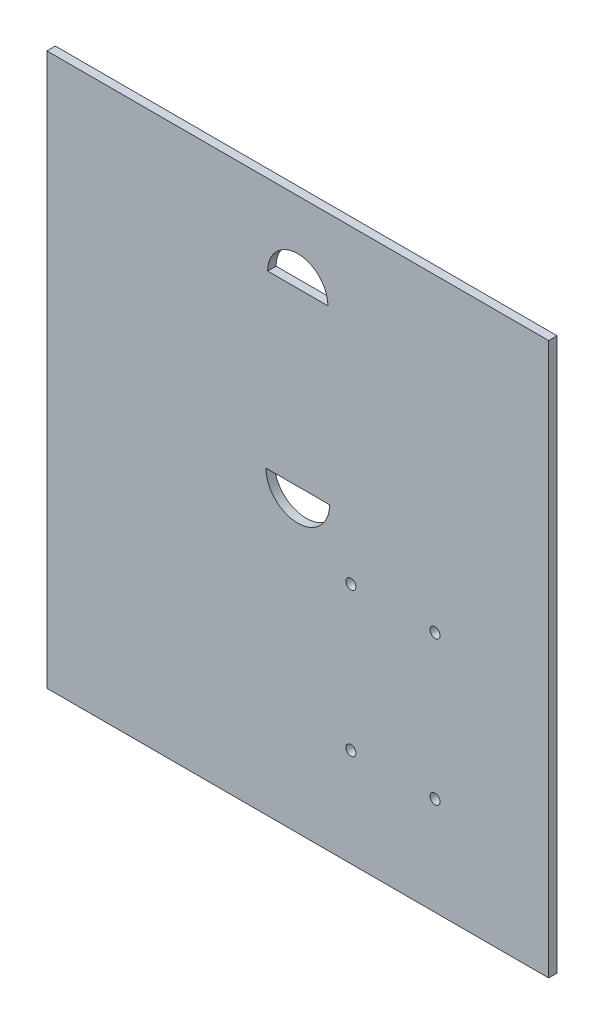
ISO-10303-21;
HEADER;
FILE_DESCRIPTION(('STEP AP214'),'2;1');
FILE_NAME('part.step','',(''),(''),'','','');
FILE_SCHEMA(('AUTOMOTIVE_DESIGN { 1 0 10303 214 1 1 1 1 }'));
ENDSEC;
DATA;
#1=APPLICATION_CONTEXT('core data for automotive mechanical design processes');
#2=APPLICATION_PROTOCOL_DEFINITION('international standard','automotive_design',2000,#1);
#3=PRODUCT_CONTEXT('',#1,'mechanical');
#4=PRODUCT('Part','Part','',(#3));
#5=PRODUCT_RELATED_PRODUCT_CATEGORY('part','',(#4));
#6=PRODUCT_DEFINITION_FORMATION('','',#4);
#7=PRODUCT_DEFINITION_CONTEXT('part definition',#1,'design');
#8=PRODUCT_DEFINITION('design','',#6,#7);
#9=PRODUCT_DEFINITION_SHAPE('','',#8);
#10=(LENGTH_UNIT() NAMED_UNIT(*) SI_UNIT(.MILLI.,.METRE.));
#11=(NAMED_UNIT(*) PLANE_ANGLE_UNIT() SI_UNIT($,.RADIAN.));
#12=(NAMED_UNIT(*) SI_UNIT($,.STERADIAN.) SOLID_ANGLE_UNIT());
#13=UNCERTAINTY_MEASURE_WITH_UNIT(LENGTH_MEASURE(1.E-05),#10,'distance_accuracy_value','');
#14=(GEOMETRIC_REPRESENTATION_CONTEXT(3) GLOBAL_UNCERTAINTY_ASSIGNED_CONTEXT((#13)) GLOBAL_UNIT_ASSIGNED_CONTEXT((#10,
#11,#12)) REPRESENTATION_CONTEXT('',''));
#15=CARTESIAN_POINT('',(0.,0.,0.));
#16=DIRECTION('',(0.,0.,1.));
#17=DIRECTION('',(1.,0.,0.));
#18=AXIS2_PLACEMENT_3D('',#15,#16,#17);
#19=CARTESIAN_POINT('',(-220.228215767635,110.114107883817,4.2));
#20=DIRECTION('',(1.,0.,0.));
#21=DIRECTION('',(0.,0.,-1.));
#22=AXIS2_PLACEMENT_3D('',#19,#20,#21);
#23=PLANE('',#22);
#24=DIRECTION('',(0.,-1.,0.));
#25=VECTOR('',#24,1.);
#26=CARTESIAN_POINT('',(-220.228215767635,110.114107883817,0.));
#27=LINE('',#26,#25);
#28=CARTESIAN_POINT('',(-220.228215767635,110.114107883817,0.));
#29=VERTEX_POINT('',#28);
#30=CARTESIAN_POINT('',(-220.228215767635,-164.885892116183,0.));
#31=VERTEX_POINT('',#30);
#32=EDGE_CURVE('E131',#29,#31,#27,.T.);
#33=ORIENTED_EDGE('',*,*,#32,.T.);
#34=DIRECTION('',(0.,0.,-1.));
#35=VECTOR('',#34,1.);
#36=CARTESIAN_POINT('',(-220.228215767635,-164.885892116183,4.2));
#37=LINE('',#36,#35);
#38=CARTESIAN_POINT('',(-220.228215767635,-164.885892116183,4.2));
#39=VERTEX_POINT('',#38);
#40=EDGE_CURVE('E11',#39,#31,#37,.T.);
#41=ORIENTED_EDGE('',*,*,#40,.F.);
#42=DIRECTION('',(0.,-1.,0.));
#43=VECTOR('',#42,1.);
#44=CARTESIAN_POINT('',(-220.228215767635,110.114107883817,4.2));
#45=LINE('',#44,#43);
#46=CARTESIAN_POINT('',(-220.228215767635,110.114107883817,4.2));
#47=VERTEX_POINT('',#46);
#48=EDGE_CURVE('E184',#47,#39,#45,.T.);
#49=ORIENTED_EDGE('',*,*,#48,.F.);
#50=DIRECTION('',(0.,0.,-1.));
#51=VECTOR('',#50,1.);
#52=CARTESIAN_POINT('',(-220.228215767635,110.114107883817,4.2));
#53=LINE('',#52,#51);
#54=EDGE_CURVE('E198',#47,#29,#53,.T.);
#55=ORIENTED_EDGE('',*,*,#54,.T.);
#56=EDGE_LOOP('',(#33,#41,#49,#55));
#57=FACE_BOUND('',#56,.T.);
#58=ADVANCED_FACE('F39',(#57),#23,.F.);
#59=CARTESIAN_POINT('',(-220.228215767635,-164.885892116183,4.2));
#60=DIRECTION('',(0.,1.,0.));
#61=DIRECTION('',(-1.,0.,0.));
#62=AXIS2_PLACEMENT_3D('',#59,#60,#61);
#63=PLANE('',#62);
#64=DIRECTION('',(1.,0.,0.));
#65=VECTOR('',#64,1.);
#66=CARTESIAN_POINT('',(-220.228215767635,-164.885892116183,0.));
#67=LINE('',#66,#65);
#68=CARTESIAN_POINT('',(29.7717842323652,-164.885892116183,0.));
#69=VERTEX_POINT('',#68);
#70=EDGE_CURVE('E202',#31,#69,#67,.T.);
#71=ORIENTED_EDGE('',*,*,#70,.T.);
#72=DIRECTION('',(0.,0.,-1.));
#73=VECTOR('',#72,1.);
#74=CARTESIAN_POINT('',(29.7717842323652,-164.885892116183,4.2));
#75=LINE('',#74,#73);
#76=CARTESIAN_POINT('',(29.7717842323652,-164.885892116183,4.2));
#77=VERTEX_POINT('',#76);
#78=EDGE_CURVE('E47',#77,#69,#75,.T.);
#79=ORIENTED_EDGE('',*,*,#78,.F.);
#80=DIRECTION('',(1.,0.,0.));
#81=VECTOR('',#80,1.);
#82=CARTESIAN_POINT('',(-220.228215767635,-164.885892116183,4.2));
#83=LINE('',#82,#81);
#84=EDGE_CURVE('E188',#39,#77,#83,.T.);
#85=ORIENTED_EDGE('',*,*,#84,.F.);
#86=ORIENTED_EDGE('',*,*,#40,.T.);
#87=EDGE_LOOP('',(#71,#79,#85,#86));
#88=FACE_BOUND('',#87,.T.);
#89=ADVANCED_FACE('F237',(#88),#63,.F.);
#90=CARTESIAN_POINT('',(29.7717842323651,110.114107883817,4.2));
#91=DIRECTION('',(-1.,0.,0.));
#92=DIRECTION('',(0.,-1.,0.));
#93=AXIS2_PLACEMENT_3D('',#90,#91,#92);
#94=PLANE('',#93);
#95=DIRECTION('',(0.,1.,0.));
#96=VECTOR('',#95,1.);
#97=CARTESIAN_POINT('',(29.7717842323651,110.114107883817,0.));
#98=LINE('',#97,#96);
#99=CARTESIAN_POINT('',(29.7717842323651,110.114107883817,0.));
#100=VERTEX_POINT('',#99);
#101=EDGE_CURVE('E205',#69,#100,#98,.T.);
#102=ORIENTED_EDGE('',*,*,#101,.T.);
#103=DIRECTION('',(0.,0.,-1.));
#104=VECTOR('',#103,1.);
#105=CARTESIAN_POINT('',(29.7717842323651,110.114107883817,4.2));
#106=LINE('',#105,#104);
#107=CARTESIAN_POINT('',(29.7717842323651,110.114107883817,4.2));
#108=VERTEX_POINT('',#107);
#109=EDGE_CURVE('E213',#108,#100,#106,.T.);
#110=ORIENTED_EDGE('',*,*,#109,.F.);
#111=DIRECTION('',(0.,1.,0.));
#112=VECTOR('',#111,1.);
#113=CARTESIAN_POINT('',(29.7717842323651,110.114107883817,4.2));
#114=LINE('',#113,#112);
#115=EDGE_CURVE('E192',#77,#108,#114,.T.);
#116=ORIENTED_EDGE('',*,*,#115,.F.);
#117=ORIENTED_EDGE('',*,*,#78,.T.);
#118=EDGE_LOOP('',(#102,#110,#116,#117));
#119=FACE_BOUND('',#118,.T.);
#120=ADVANCED_FACE('F222',(#119),#94,.F.);
#121=CARTESIAN_POINT('',(-220.228215767635,110.114107883817,4.2));
#122=DIRECTION('',(0.,-1.,0.));
#123=DIRECTION('',(0.,0.,-1.));
#124=AXIS2_PLACEMENT_3D('',#121,#122,#123);
#125=PLANE('',#124);
#126=DIRECTION('',(-1.,0.,0.));
#127=VECTOR('',#126,1.);
#128=CARTESIAN_POINT('',(-220.228215767635,110.114107883817,0.));
#129=LINE('',#128,#127);
#130=EDGE_CURVE('E189',#100,#29,#129,.T.);
#131=ORIENTED_EDGE('',*,*,#130,.T.);
#132=ORIENTED_EDGE('',*,*,#54,.F.);
#133=DIRECTION('',(-1.,0.,0.));
#134=VECTOR('',#133,1.);
#135=CARTESIAN_POINT('',(-220.228215767635,110.114107883817,4.2));
#136=LINE('',#135,#134);
#137=EDGE_CURVE('E195',#108,#47,#136,.T.);
#138=ORIENTED_EDGE('',*,*,#137,.F.);
#139=ORIENTED_EDGE('',*,*,#109,.T.);
#140=EDGE_LOOP('',(#131,#132,#138,#139));
#141=FACE_BOUND('',#140,.T.);
#142=ADVANCED_FACE('F230',(#141),#125,.F.);
#143=CARTESIAN_POINT('',(0.,0.,4.2));
#144=DIRECTION('',(0.,0.,1.));
#145=DIRECTION('',(1.,0.,0.));
#146=AXIS2_PLACEMENT_3D('',#143,#144,#145);
#147=PLANE('',#146);
#148=CARTESIAN_POINT('',(-95.2282157676349,70.1141078838174,4.2));
#149=DIRECTION('',(0.,0.,1.));
#150=DIRECTION('',(-1.,0.,0.));
#151=AXIS2_PLACEMENT_3D('',#148,#149,#150);
#152=CIRCLE('',#151,15.);
#153=CARTESIAN_POINT('',(-80.2282157676349,70.1141078838174,4.2));
#154=VERTEX_POINT('',#153);
#155=CARTESIAN_POINT('',(-110.228215767635,70.1141078838174,4.2));
#156=VERTEX_POINT('',#155);
#157=EDGE_CURVE('E54',#154,#156,#152,.T.);
#158=ORIENTED_EDGE('',*,*,#157,.F.);
#159=DIRECTION('',(1.,0.,0.));
#160=VECTOR('',#159,1.);
#161=CARTESIAN_POINT('',(-110.228215767635,70.1141078838174,4.2));
#162=LINE('',#161,#160);
#163=EDGE_CURVE('E122',#156,#154,#162,.T.);
#164=ORIENTED_EDGE('',*,*,#163,.F.);
#165=EDGE_LOOP('',(#158,#164));
#166=FACE_BOUND('',#165,.T.);
#167=CARTESIAN_POINT('',(-26.8585259833665,-44.1885854254577,4.2));
#168=DIRECTION('',(0.,0.,1.));
#169=DIRECTION('',(1.,0.,0.));
#170=AXIS2_PLACEMENT_3D('',#167,#168,#169);
#171=CIRCLE('',#170,2.50000008);
#172=CARTESIAN_POINT('',(-24.3585259033665,-44.1885854254577,4.2));
#173=VERTEX_POINT('',#172);
#174=EDGE_CURVE('E138',#173,#173,#171,.T.);
#175=ORIENTED_EDGE('',*,*,#174,.F.);
#176=EDGE_LOOP('',(#175));
#177=FACE_BOUND('',#176,.T.);
#178=CARTESIAN_POINT('',(-68.7685259833665,-115.943585425458,4.2));
#179=DIRECTION('',(0.,0.,1.));
#180=DIRECTION('',(1.,0.,0.));
#181=AXIS2_PLACEMENT_3D('',#178,#179,#180);
#182=CIRCLE('',#181,2.50000007999997);
#183=CARTESIAN_POINT('',(-66.2685259033665,-115.943585425458,4.2));
#184=VERTEX_POINT('',#183);
#185=EDGE_CURVE('E160',#184,#184,#182,.T.);
#186=ORIENTED_EDGE('',*,*,#185,.F.);
#187=EDGE_LOOP('',(#186));
#188=FACE_BOUND('',#187,.T.);
#189=CARTESIAN_POINT('',(-95.2282157676349,-15.3058921161826,4.2));
#190=DIRECTION('',(0.,0.,1.));
#191=DIRECTION('',(1.,0.,0.));
#192=AXIS2_PLACEMENT_3D('',#189,#190,#191);
#193=CIRCLE('',#192,15.8456781145647);
#194=CARTESIAN_POINT('',(-111.0738938822,-15.3058921161826,4.2));
#195=VERTEX_POINT('',#194);
#196=CARTESIAN_POINT('',(-79.3825376530702,-15.3058921161826,4.2));
#197=VERTEX_POINT('',#196);
#198=EDGE_CURVE('E62',#195,#197,#193,.T.);
#199=ORIENTED_EDGE('',*,*,#198,.F.);
#200=DIRECTION('',(-1.,0.,0.));
#201=VECTOR('',#200,1.);
#202=CARTESIAN_POINT('',(-111.0738938822,-15.3058921161826,4.2));
#203=LINE('',#202,#201);
#204=EDGE_CURVE('E170',#197,#195,#203,.T.);
#205=ORIENTED_EDGE('',*,*,#204,.F.);
#206=EDGE_LOOP('',(#199,#205));
#207=FACE_BOUND('',#206,.T.);
#208=CARTESIAN_POINT('',(-26.8585259833665,-115.943585425458,4.2));
#209=DIRECTION('',(0.,0.,1.));
#210=DIRECTION('',(1.,0.,0.));
#211=AXIS2_PLACEMENT_3D('',#208,#209,#210);
#212=CIRCLE('',#211,2.50000008);
#213=CARTESIAN_POINT('',(-24.3585259033665,-115.943585425458,4.2));
#214=VERTEX_POINT('',#213);
#215=EDGE_CURVE('E146',#214,#214,#212,.T.);
#216=ORIENTED_EDGE('',*,*,#215,.F.);
#217=EDGE_LOOP('',(#216));
#218=FACE_BOUND('',#217,.T.);
#219=CARTESIAN_POINT('',(-68.7685259833665,-44.1885854254577,4.2));
#220=DIRECTION('',(0.,0.,1.));
#221=DIRECTION('',(1.,0.,0.));
#222=AXIS2_PLACEMENT_3D('',#219,#220,#221);
#223=CIRCLE('',#222,2.50000007999997);
#224=CARTESIAN_POINT('',(-66.2685259033665,-44.1885854254577,4.2));
#225=VERTEX_POINT('',#224);
#226=EDGE_CURVE('E137',#225,#225,#223,.T.);
#227=ORIENTED_EDGE('',*,*,#226,.F.);
#228=EDGE_LOOP('',(#227));
#229=FACE_BOUND('',#228,.T.);
#230=ORIENTED_EDGE('',*,*,#48,.T.);
#231=ORIENTED_EDGE('',*,*,#84,.T.);
#232=ORIENTED_EDGE('',*,*,#115,.T.);
#233=ORIENTED_EDGE('',*,*,#137,.T.);
#234=EDGE_LOOP('',(#230,#231,#232,#233));
#235=FACE_BOUND('',#234,.T.);
#236=ADVANCED_FACE('F236',(#166,#177,#188,#207,#218,#229,#235),#147,.T.);
#237=CARTESIAN_POINT('',(0.,0.,0.));
#238=DIRECTION('',(0.,0.,1.));
#239=DIRECTION('',(1.,0.,0.));
#240=AXIS2_PLACEMENT_3D('',#237,#238,#239);
#241=PLANE('',#240);
#242=DIRECTION('',(1.,0.,0.));
#243=VECTOR('',#242,1.);
#244=CARTESIAN_POINT('',(-110.228215767635,70.1141078838174,0.));
#245=LINE('',#244,#243);
#246=CARTESIAN_POINT('',(-110.228215767635,70.1141078838174,0.));
#247=VERTEX_POINT('',#246);
#248=CARTESIAN_POINT('',(-80.2282157676349,70.1141078838174,0.));
#249=VERTEX_POINT('',#248);
#250=EDGE_CURVE('E112',#247,#249,#245,.T.);
#251=ORIENTED_EDGE('',*,*,#250,.T.);
#252=CARTESIAN_POINT('',(-95.2282157676349,70.1141078838174,0.));
#253=DIRECTION('',(0.,0.,1.));
#254=DIRECTION('',(-1.,0.,0.));
#255=AXIS2_PLACEMENT_3D('',#252,#253,#254);
#256=CIRCLE('',#255,15.);
#257=EDGE_CURVE('E105',#249,#247,#256,.T.);
#258=ORIENTED_EDGE('',*,*,#257,.T.);
#259=EDGE_LOOP('',(#251,#258));
#260=FACE_BOUND('',#259,.T.);
#261=CARTESIAN_POINT('',(-26.8585259833665,-44.1885854254577,0.));
#262=DIRECTION('',(0.,0.,1.));
#263=DIRECTION('',(1.,0.,0.));
#264=AXIS2_PLACEMENT_3D('',#261,#262,#263);
#265=CIRCLE('',#264,2.50000008);
#266=CARTESIAN_POINT('',(-24.3585259033665,-44.1885854254577,0.));
#267=VERTEX_POINT('',#266);
#268=EDGE_CURVE('E133',#267,#267,#265,.T.);
#269=ORIENTED_EDGE('',*,*,#268,.T.);
#270=EDGE_LOOP('',(#269));
#271=FACE_BOUND('',#270,.T.);
#272=CARTESIAN_POINT('',(-68.7685259833665,-115.943585425458,0.));
#273=DIRECTION('',(0.,0.,1.));
#274=DIRECTION('',(1.,0.,0.));
#275=AXIS2_PLACEMENT_3D('',#272,#273,#274);
#276=CIRCLE('',#275,2.50000007999997);
#277=CARTESIAN_POINT('',(-66.2685259033665,-115.943585425458,0.));
#278=VERTEX_POINT('',#277);
#279=EDGE_CURVE('E128',#278,#278,#276,.T.);
#280=ORIENTED_EDGE('',*,*,#279,.T.);
#281=EDGE_LOOP('',(#280));
#282=FACE_BOUND('',#281,.T.);
#283=DIRECTION('',(-1.,0.,0.));
#284=VECTOR('',#283,1.);
#285=CARTESIAN_POINT('',(-111.0738938822,-15.3058921161826,0.));
#286=LINE('',#285,#284);
#287=CARTESIAN_POINT('',(-79.3825376530702,-15.3058921161826,0.));
#288=VERTEX_POINT('',#287);
#289=CARTESIAN_POINT('',(-111.0738938822,-15.3058921161826,0.));
#290=VERTEX_POINT('',#289);
#291=EDGE_CURVE('E169',#288,#290,#286,.T.);
#292=ORIENTED_EDGE('',*,*,#291,.T.);
#293=CARTESIAN_POINT('',(-95.2282157676349,-15.3058921161826,0.));
#294=DIRECTION('',(0.,0.,1.));
#295=DIRECTION('',(1.,0.,0.));
#296=AXIS2_PLACEMENT_3D('',#293,#294,#295);
#297=CIRCLE('',#296,15.8456781145647);
#298=EDGE_CURVE('E165',#290,#288,#297,.T.);
#299=ORIENTED_EDGE('',*,*,#298,.T.);
#300=EDGE_LOOP('',(#292,#299));
#301=FACE_BOUND('',#300,.T.);
#302=CARTESIAN_POINT('',(-26.8585259833665,-115.943585425458,0.));
#303=DIRECTION('',(0.,0.,1.));
#304=DIRECTION('',(1.,0.,0.));
#305=AXIS2_PLACEMENT_3D('',#302,#303,#304);
#306=CIRCLE('',#305,2.50000008);
#307=CARTESIAN_POINT('',(-24.3585259033665,-115.943585425458,0.));
#308=VERTEX_POINT('',#307);
#309=EDGE_CURVE('E142',#308,#308,#306,.T.);
#310=ORIENTED_EDGE('',*,*,#309,.T.);
#311=EDGE_LOOP('',(#310));
#312=FACE_BOUND('',#311,.T.);
#313=CARTESIAN_POINT('',(-68.7685259833665,-44.1885854254577,0.));
#314=DIRECTION('',(0.,0.,1.));
#315=DIRECTION('',(1.,0.,0.));
#316=AXIS2_PLACEMENT_3D('',#313,#314,#315);
#317=CIRCLE('',#316,2.50000007999997);
#318=CARTESIAN_POINT('',(-66.2685259033665,-44.1885854254577,0.));
#319=VERTEX_POINT('',#318);
#320=EDGE_CURVE('E150',#319,#319,#317,.T.);
#321=ORIENTED_EDGE('',*,*,#320,.T.);
#322=EDGE_LOOP('',(#321));
#323=FACE_BOUND('',#322,.T.);
#324=ORIENTED_EDGE('',*,*,#32,.F.);
#325=ORIENTED_EDGE('',*,*,#130,.F.);
#326=ORIENTED_EDGE('',*,*,#101,.F.);
#327=ORIENTED_EDGE('',*,*,#70,.F.);
#328=EDGE_LOOP('',(#324,#325,#326,#327));
#329=FACE_BOUND('',#328,.T.);
#330=ADVANCED_FACE('F119',(#260,#271,#282,#301,#312,#323,#329),#241,.F.);
#331=CARTESIAN_POINT('',(-68.7685259833665,-44.1885854254577,0.));
#332=DIRECTION('',(0.,0.,1.));
#333=DIRECTION('',(1.,0.,0.));
#334=AXIS2_PLACEMENT_3D('',#331,#332,#333);
#335=CYLINDRICAL_SURFACE('',#334,2.50000007999997);
#336=ORIENTED_EDGE('',*,*,#320,.F.);
#337=EDGE_LOOP('',(#336));
#338=FACE_BOUND('',#337,.T.);
#339=ORIENTED_EDGE('',*,*,#226,.T.);
#340=EDGE_LOOP('',(#339));
#341=FACE_BOUND('',#340,.T.);
#342=ADVANCED_FACE('F249',(#338,#341),#335,.F.);
#343=CARTESIAN_POINT('',(-26.8585259833665,-115.943585425458,0.));
#344=DIRECTION('',(0.,0.,1.));
#345=DIRECTION('',(1.,0.,0.));
#346=AXIS2_PLACEMENT_3D('',#343,#344,#345);
#347=CYLINDRICAL_SURFACE('',#346,2.50000008);
#348=ORIENTED_EDGE('',*,*,#309,.F.);
#349=EDGE_LOOP('',(#348));
#350=FACE_BOUND('',#349,.T.);
#351=ORIENTED_EDGE('',*,*,#215,.T.);
#352=EDGE_LOOP('',(#351));
#353=FACE_BOUND('',#352,.T.);
#354=ADVANCED_FACE('F257',(#350,#353),#347,.F.);
#355=CARTESIAN_POINT('',(-95.2282157676349,-15.3058921161826,0.));
#356=DIRECTION('',(0.,0.,1.));
#357=DIRECTION('',(1.,0.,0.));
#358=AXIS2_PLACEMENT_3D('',#355,#356,#357);
#359=CYLINDRICAL_SURFACE('',#358,15.8456781145647);
#360=ORIENTED_EDGE('',*,*,#198,.T.);
#361=DIRECTION('',(0.,0.,1.));
#362=VECTOR('',#361,1.);
#363=CARTESIAN_POINT('',(-79.3825376530702,-15.3058921161826,0.));
#364=LINE('',#363,#362);
#365=EDGE_CURVE('E174',#288,#197,#364,.T.);
#366=ORIENTED_EDGE('',*,*,#365,.F.);
#367=ORIENTED_EDGE('',*,*,#298,.F.);
#368=DIRECTION('',(0.,0.,1.));
#369=VECTOR('',#368,1.);
#370=CARTESIAN_POINT('',(-111.0738938822,-15.3058921161826,0.));
#371=LINE('',#370,#369);
#372=EDGE_CURVE('E164',#290,#195,#371,.T.);
#373=ORIENTED_EDGE('',*,*,#372,.T.);
#374=EDGE_LOOP('',(#360,#366,#367,#373));
#375=FACE_BOUND('',#374,.T.);
#376=ADVANCED_FACE('F253',(#375),#359,.F.);
#377=CARTESIAN_POINT('',(-111.0738938822,-15.3058921161826,0.));
#378=DIRECTION('',(0.,1.,0.));
#379=DIRECTION('',(0.,0.,1.));
#380=AXIS2_PLACEMENT_3D('',#377,#378,#379);
#381=PLANE('',#380);
#382=ORIENTED_EDGE('',*,*,#204,.T.);
#383=ORIENTED_EDGE('',*,*,#372,.F.);
#384=ORIENTED_EDGE('',*,*,#291,.F.);
#385=ORIENTED_EDGE('',*,*,#365,.T.);
#386=EDGE_LOOP('',(#382,#383,#384,#385));
#387=FACE_BOUND('',#386,.T.);
#388=ADVANCED_FACE('F256',(#387),#381,.F.);
#389=CARTESIAN_POINT('',(-68.7685259833665,-115.943585425458,0.));
#390=DIRECTION('',(0.,0.,1.));
#391=DIRECTION('',(1.,0.,0.));
#392=AXIS2_PLACEMENT_3D('',#389,#390,#391);
#393=CYLINDRICAL_SURFACE('',#392,2.50000007999997);
#394=ORIENTED_EDGE('',*,*,#279,.F.);
#395=EDGE_LOOP('',(#394));
#396=FACE_BOUND('',#395,.T.);
#397=ORIENTED_EDGE('',*,*,#185,.T.);
#398=EDGE_LOOP('',(#397));
#399=FACE_BOUND('',#398,.T.);
#400=ADVANCED_FACE('F260',(#396,#399),#393,.F.);
#401=CARTESIAN_POINT('',(-26.8585259833665,-44.1885854254577,0.));
#402=DIRECTION('',(0.,0.,1.));
#403=DIRECTION('',(1.,0.,0.));
#404=AXIS2_PLACEMENT_3D('',#401,#402,#403);
#405=CYLINDRICAL_SURFACE('',#404,2.50000008);
#406=ORIENTED_EDGE('',*,*,#268,.F.);
#407=EDGE_LOOP('',(#406));
#408=FACE_BOUND('',#407,.T.);
#409=ORIENTED_EDGE('',*,*,#174,.T.);
#410=EDGE_LOOP('',(#409));
#411=FACE_BOUND('',#410,.T.);
#412=ADVANCED_FACE('F264',(#408,#411),#405,.F.);
#413=CARTESIAN_POINT('',(-95.2282157676349,70.1141078838174,0.));
#414=DIRECTION('',(0.,0.,1.));
#415=DIRECTION('',(1.,0.,0.));
#416=AXIS2_PLACEMENT_3D('',#413,#414,#415);
#417=CYLINDRICAL_SURFACE('',#416,15.);
#418=ORIENTED_EDGE('',*,*,#157,.T.);
#419=DIRECTION('',(0.,0.,1.));
#420=VECTOR('',#419,1.);
#421=CARTESIAN_POINT('',(-110.228215767635,70.1141078838174,0.));
#422=LINE('',#421,#420);
#423=EDGE_CURVE('E101',#247,#156,#422,.T.);
#424=ORIENTED_EDGE('',*,*,#423,.F.);
#425=ORIENTED_EDGE('',*,*,#257,.F.);
#426=DIRECTION('',(0.,0.,1.));
#427=VECTOR('',#426,1.);
#428=CARTESIAN_POINT('',(-80.2282157676349,70.1141078838174,0.));
#429=LINE('',#428,#427);
#430=EDGE_CURVE('E111',#249,#154,#429,.T.);
#431=ORIENTED_EDGE('',*,*,#430,.T.);
#432=EDGE_LOOP('',(#418,#424,#425,#431));
#433=FACE_BOUND('',#432,.T.);
#434=ADVANCED_FACE('F103',(#433),#417,.F.);
#435=CARTESIAN_POINT('',(-110.228215767635,70.1141078838174,0.));
#436=DIRECTION('',(0.,-1.,0.));
#437=DIRECTION('',(0.,0.,-1.));
#438=AXIS2_PLACEMENT_3D('',#435,#436,#437);
#439=PLANE('',#438);
#440=ORIENTED_EDGE('',*,*,#163,.T.);
#441=ORIENTED_EDGE('',*,*,#430,.F.);
#442=ORIENTED_EDGE('',*,*,#250,.F.);
#443=ORIENTED_EDGE('',*,*,#423,.T.);
#444=EDGE_LOOP('',(#440,#441,#442,#443));
#445=FACE_BOUND('',#444,.T.);
#446=ADVANCED_FACE('F115',(#445),#439,.F.);
#447=CLOSED_SHELL('',(#58,#89,#120,#142,#236,#330,#342,#354,#376,#388,#400,#412,#434,#446));
#448=MANIFOLD_SOLID_BREP('B2',#447);
#449=ADVANCED_BREP_SHAPE_REPRESENTATION('',(#18,#448),#14);
#450=SHAPE_DEFINITION_REPRESENTATION(#9,#449);
ENDSEC;
END-ISO-10303-21;
